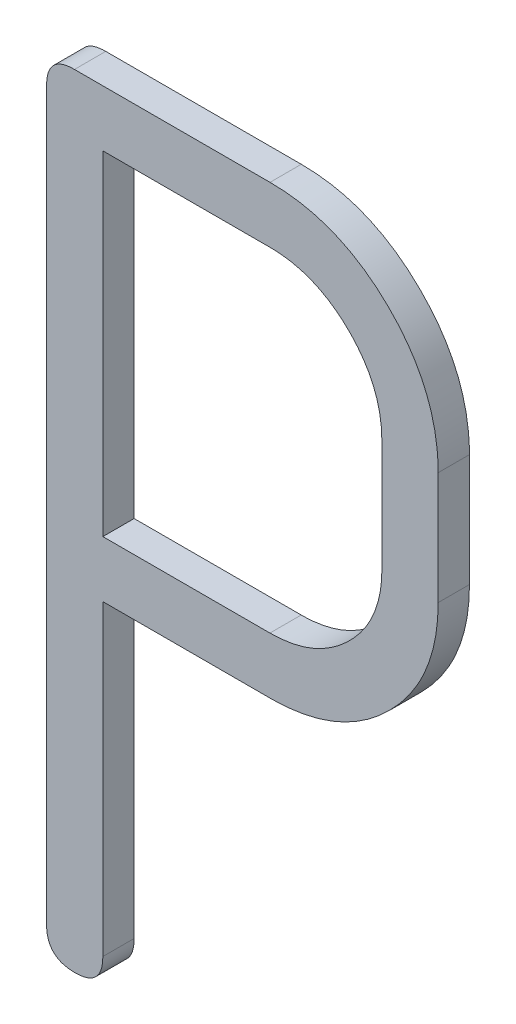
ISO-10303-21;
HEADER;
FILE_DESCRIPTION(('STEP AP214'),'2;1');
FILE_NAME('part.step','',(''),(''),'','','');
FILE_SCHEMA(('AUTOMOTIVE_DESIGN { 1 0 10303 214 1 1 1 1 }'));
ENDSEC;
DATA;
#1=APPLICATION_CONTEXT('core data for automotive mechanical design processes');
#2=APPLICATION_PROTOCOL_DEFINITION('international standard','automotive_design',2000,#1);
#3=PRODUCT_CONTEXT('',#1,'mechanical');
#4=PRODUCT('Part','Part','',(#3));
#5=PRODUCT_RELATED_PRODUCT_CATEGORY('part','',(#4));
#6=PRODUCT_DEFINITION_FORMATION('','',#4);
#7=PRODUCT_DEFINITION_CONTEXT('part definition',#1,'design');
#8=PRODUCT_DEFINITION('design','',#6,#7);
#9=PRODUCT_DEFINITION_SHAPE('','',#8);
#10=(LENGTH_UNIT() NAMED_UNIT(*) SI_UNIT(.MILLI.,.METRE.));
#11=(NAMED_UNIT(*) PLANE_ANGLE_UNIT() SI_UNIT($,.RADIAN.));
#12=(NAMED_UNIT(*) SI_UNIT($,.STERADIAN.) SOLID_ANGLE_UNIT());
#13=UNCERTAINTY_MEASURE_WITH_UNIT(LENGTH_MEASURE(1.E-05),#10,'distance_accuracy_value','');
#14=(GEOMETRIC_REPRESENTATION_CONTEXT(3) GLOBAL_UNCERTAINTY_ASSIGNED_CONTEXT((#13)) GLOBAL_UNIT_ASSIGNED_CONTEXT((#10,
#11,#12)) REPRESENTATION_CONTEXT('',''));
#15=CARTESIAN_POINT('',(0.,0.,0.));
#16=DIRECTION('',(0.,0.,1.));
#17=DIRECTION('',(1.,0.,0.));
#18=AXIS2_PLACEMENT_3D('',#15,#16,#17);
#19=CARTESIAN_POINT('',(0.,0.,1.6));
#20=DIRECTION('',(0.,0.,-1.));
#21=DIRECTION('',(-1.,0.,0.));
#22=AXIS2_PLACEMENT_3D('',#19,#20,#21);
#23=PLANE('',#22);
#24=DIRECTION('',(0.,1.,0.));
#25=VECTOR('',#24,1.);
#26=CARTESIAN_POINT('',(-3.6989437525272,0.,1.6));
#27=LINE('',#26,#25);
#28=CARTESIAN_POINT('',(-3.6989437525272,-20.1083672798276,1.6));
#29=VERTEX_POINT('',#28);
#30=CARTESIAN_POINT('',(-3.6989437525272,-20.4680547798276,1.6));
#31=VERTEX_POINT('',#30);
#32=EDGE_CURVE('E248',#29,#31,#27,.F.);
#33=ORIENTED_EDGE('',*,*,#32,.T.);
#34=CARTESIAN_POINT('',(-3.6989437525272,-20.4680547798276,1.6));
#35=CARTESIAN_POINT('',(-3.69893977911239,-20.4842043604399,1.6));
#36=CARTESIAN_POINT('',(-3.69956740178276,-20.5003633830072,1.6));
#37=CARTESIAN_POINT('',(-3.70218491900404,-20.5325881625536,1.6));
#38=CARTESIAN_POINT('',(-3.70417640120065,-20.5486537888071,1.6));
#39=CARTESIAN_POINT('',(-3.70959937157517,-20.5804136083056,1.6));
#40=CARTESIAN_POINT('',(-3.71301919440083,-20.5961097461993,1.6));
#41=CARTESIAN_POINT('',(-3.72133266115948,-20.6270933338311,1.6));
#42=CARTESIAN_POINT('',(-3.72622564042608,-20.6423809645019,1.6));
#43=CARTESIAN_POINT('',(-3.74322254794326,-20.6876324033744,1.6));
#44=CARTESIAN_POINT('',(-3.75761176773419,-20.716785285045,1.6));
#45=CARTESIAN_POINT('',(-3.78313633375931,-20.7580159064221,1.6));
#46=CARTESIAN_POINT('',(-3.79231919740512,-20.7713623608529,1.6));
#47=CARTESIAN_POINT('',(-3.81185281725684,-20.7971811642223,1.6));
#48=CARTESIAN_POINT('',(-3.82220375053391,-20.8096533801668,1.6));
#49=CARTESIAN_POINT('',(-3.84275088545525,-20.8324182182707,1.6));
#50=CARTESIAN_POINT('',(-3.85284725315506,-20.8428017549347,1.6));
#51=CARTESIAN_POINT('',(-3.87373960159541,-20.8628320989359,1.6));
#52=CARTESIAN_POINT('',(-3.88453546345096,-20.8724790308613,1.6));
#53=CARTESIAN_POINT('',(-3.91795904762217,-20.9001014927919,1.6));
#54=CARTESIAN_POINT('',(-3.94166807389486,-20.9168096438358,1.6));
#55=CARTESIAN_POINT('',(-3.99414499916089,-20.9474368329106,1.6));
#56=CARTESIAN_POINT('',(-4.0231822005852,-20.9608984793153,1.6));
#57=CARTESIAN_POINT('',(-4.08331658328884,-20.9820235646375,1.6));
#58=CARTESIAN_POINT('',(-4.11441507617614,-20.9896832724838,1.6));
#59=CARTESIAN_POINT('',(-4.1607917691538,-20.996872999856,1.6));
#60=CARTESIAN_POINT('',(-4.175776797228,-20.9985600194299,1.6));
#61=CARTESIAN_POINT('',(-4.2057803379642,-21.0007735700299,1.6));
#62=CARTESIAN_POINT('',(-4.22079854566026,-21.0013041768755,1.6));
#63=CARTESIAN_POINT('',(-4.2358187525272,-21.0013047798276,1.6));
#64=B_SPLINE_CURVE_WITH_KNOTS('',3,(#34,#35,#36,#37,#38,#39,#40,#41,#42,#43,#44,#45,#46,#47,#48,
#49,#50,#51,#52,#53,#54,#55,#56,#57,#58,#59,#60,#61,#62,#63),.UNSPECIFIED.,.F.,.F.,(4,2,2,2,2,2,
2,2,2,2,2,2,2,2,4),(0.,0.0484501258117373,0.0969567476731444,0.145074728323627,
0.193171031305145,0.289959954975703,0.338510203090539,0.387067820994286,0.430479940732755,
0.473884701468916,0.560491692403382,0.655919601948308,0.751408826644595,0.796611784497144,
0.841655163438556),.UNSPECIFIED.);
#65=CARTESIAN_POINT('',(-4.2358187525272,-21.0013047798276,1.6));
#66=VERTEX_POINT('',#65);
#67=EDGE_CURVE('E243',#31,#66,#64,.T.);
#68=ORIENTED_EDGE('',*,*,#67,.T.);
#69=DIRECTION('',(-1.,0.,0.));
#70=VECTOR('',#69,1.);
#71=CARTESIAN_POINT('',(0.,-21.0013047798276,1.6));
#72=LINE('',#71,#70);
#73=CARTESIAN_POINT('',(-4.7709437525272,-21.0013047798276,1.6));
#74=VERTEX_POINT('',#73);
#75=EDGE_CURVE('E128',#66,#74,#72,.T.);
#76=ORIENTED_EDGE('',*,*,#75,.T.);
#77=DIRECTION('',(0.,1.,0.));
#78=VECTOR('',#77,1.);
#79=CARTESIAN_POINT('',(-4.7709437525272,-21.0013047798276,1.6));
#80=LINE('',#79,#78);
#81=CARTESIAN_POINT('',(-4.7709437525272,-21.9839922798276,1.6));
#82=VERTEX_POINT('',#81);
#83=EDGE_CURVE('E159',#82,#74,#80,.T.);
#84=ORIENTED_EDGE('',*,*,#83,.F.);
#85=CARTESIAN_POINT('',(-4.7709437525272,-21.9839922798276,1.6));
#86=CARTESIAN_POINT('',(-4.7709437525272,-22.0733047798276,1.6));
#87=CARTESIAN_POINT('',(-4.8609437525272,-22.0733047798276,1.6));
#88=B_SPLINE_CURVE_WITH_KNOTS('',2,(#85,#86,#87),.UNSPECIFIED.,.F.,.F.,(3,3),(0.,1.),.UNSPECIFIED.);
#89=CARTESIAN_POINT('',(-4.8609437525272,-22.0733047798276,1.6));
#90=VERTEX_POINT('',#89);
#91=EDGE_CURVE('E227',#82,#90,#88,.T.);
#92=ORIENTED_EDGE('',*,*,#91,.T.);
#93=CARTESIAN_POINT('',(-4.8609437525272,-22.0733047798276,1.6));
#94=CARTESIAN_POINT('',(-4.9509437525272,-22.0733047798276,1.6));
#95=CARTESIAN_POINT('',(-4.9509437525272,-21.9838672798276,1.6));
#96=B_SPLINE_CURVE_WITH_KNOTS('',2,(#93,#94,#95),.UNSPECIFIED.,.F.,.F.,(3,3),(0.,1.),.UNSPECIFIED.);
#97=CARTESIAN_POINT('',(-4.9509437525272,-21.9838672798276,1.6));
#98=VERTEX_POINT('',#97);
#99=EDGE_CURVE('E232',#90,#98,#96,.T.);
#100=ORIENTED_EDGE('',*,*,#99,.T.);
#101=DIRECTION('',(0.,1.,0.));
#102=VECTOR('',#101,1.);
#103=CARTESIAN_POINT('',(-4.9509437525272,-21.9838672798276,1.6));
#104=LINE('',#103,#102);
#105=CARTESIAN_POINT('',(-4.9509437525272,-19.6627422798276,1.6));
#106=VERTEX_POINT('',#105);
#107=EDGE_CURVE('E386',#106,#98,#104,.F.);
#108=ORIENTED_EDGE('',*,*,#107,.F.);
#109=CARTESIAN_POINT('',(-4.9509437525272,-19.6627422798276,1.6));
#110=CARTESIAN_POINT('',(-4.9509437525272,-19.5733047798276,1.6));
#111=CARTESIAN_POINT('',(-4.8616312525272,-19.5733047798276,1.6));
#112=B_SPLINE_CURVE_WITH_KNOTS('',2,(#109,#110,#111),.UNSPECIFIED.,.F.,.F.,(3,3),(0.,1.),.UNSPECIFIED.);
#113=CARTESIAN_POINT('',(-4.8616312525272,-19.5733047798276,1.6));
#114=VERTEX_POINT('',#113);
#115=EDGE_CURVE('E124',#106,#114,#112,.T.);
#116=ORIENTED_EDGE('',*,*,#115,.T.);
#117=DIRECTION('',(-1.,0.,0.));
#118=VECTOR('',#117,1.);
#119=CARTESIAN_POINT('',(0.,-19.5733047798276,1.6));
#120=LINE('',#119,#118);
#121=CARTESIAN_POINT('',(-4.2365062525272,-19.5733047798276,1.6));
#122=VERTEX_POINT('',#121);
#123=EDGE_CURVE('E254',#114,#122,#120,.F.);
#124=ORIENTED_EDGE('',*,*,#123,.T.);
#125=CARTESIAN_POINT('',(-4.2365062525272,-19.5733047798276,1.6));
#126=CARTESIAN_POINT('',(-4.22030749403513,-19.5733004995456,1.6));
#127=CARTESIAN_POINT('',(-4.20409974747182,-19.5739331810774,1.6));
#128=CARTESIAN_POINT('',(-4.17178002095022,-19.5765657218345,1.6));
#129=CARTESIAN_POINT('',(-4.15566815908528,-19.5785670124189,1.6));
#130=CARTESIAN_POINT('',(-4.1238236848035,-19.5840073137464,1.6));
#131=CARTESIAN_POINT('',(-4.10808901720153,-19.587434019707,1.6));
#132=CARTESIAN_POINT('',(-4.07702471857944,-19.5957529250261,1.6));
#133=CARTESIAN_POINT('',(-4.06169492276077,-19.6006445177938,1.6));
#134=CARTESIAN_POINT('',(-4.01632670108878,-19.6176064511381,1.6));
#135=CARTESIAN_POINT('',(-3.9870872744213,-19.6319346198206,1.6));
#136=CARTESIAN_POINT('',(-3.94565790517282,-19.6573118624664,1.6));
#137=CARTESIAN_POINT('',(-3.93223157066039,-19.6664379735748,1.6));
#138=CARTESIAN_POINT('',(-3.90623000421619,-19.6858434402944,1.6));
#139=CARTESIAN_POINT('',(-3.89365492340969,-19.6961229998238,1.6));
#140=CARTESIAN_POINT('',(-3.8704644863254,-19.7167035601166,1.6));
#141=CARTESIAN_POINT('',(-3.85977435931062,-19.7269209801873,1.6));
#142=CARTESIAN_POINT('',(-3.839148705072,-19.7480842826033,1.6));
#143=CARTESIAN_POINT('',(-3.82921304581456,-19.7590300368566,1.6));
#144=CARTESIAN_POINT('',(-3.80077470352813,-19.7929517582412,1.6));
#145=CARTESIAN_POINT('',(-3.78358185840524,-19.8170634138259,1.6));
#146=CARTESIAN_POINT('',(-3.75241454746255,-19.8700954564841,1.6));
#147=CARTESIAN_POINT('',(-3.73883490618979,-19.8992500313269,1.6));
#148=CARTESIAN_POINT('',(-3.71761999188604,-19.9596702937609,1.6));
#149=CARTESIAN_POINT('',(-3.70998804541835,-19.990937152151,1.6));
#150=CARTESIAN_POINT('',(-3.70306755748842,-20.0367987932142,1.6));
#151=CARTESIAN_POINT('',(-3.70149883783485,-20.0510952390639,1.6));
#152=CARTESIAN_POINT('',(-3.69943927810337,-20.0797160847678,1.6));
#153=CARTESIAN_POINT('',(-3.69894466746037,-20.0940402095834,1.6));
#154=CARTESIAN_POINT('',(-3.6989437525272,-20.1083672798276,1.6));
#155=B_SPLINE_CURVE_WITH_KNOTS('',3,(#125,#126,#127,#128,#129,#130,#131,#132,#133,#134,#135,
#136,#137,#138,#139,#140,#141,#142,#143,#144,#145,#146,#147,#148,#149,#150,#151,#152,#153,#154),
.UNSPECIFIED.,.F.,.F.,(4,2,2,2,2,2,2,2,2,2,2,2,2,2,4),(0.,0.0485968068317986,0.0972445164896146,
0.145480718280289,0.193696973628828,0.290661396228357,0.339315410739956,0.387978040393372,
0.432303180828381,0.476620546298398,0.5650237036141,0.660898519651086,0.756826920348496,
0.79994195333816,0.84290538847964),.UNSPECIFIED.);
#156=EDGE_CURVE('E24',#122,#29,#155,.T.);
#157=ORIENTED_EDGE('',*,*,#156,.T.);
#158=EDGE_LOOP('',(#33,#68,#76,#84,#92,#100,#108,#116,#124,#157));
#159=FACE_BOUND('',#158,.T.);
#160=CARTESIAN_POINT('',(-4.2368187525272,-19.7533047798276,1.6));
#161=CARTESIAN_POINT('',(-4.21993643108536,-19.7532793325113,1.6));
#162=CARTESIAN_POINT('',(-4.20302699528636,-19.7543509612065,1.6));
#163=CARTESIAN_POINT('',(-4.16957097166548,-19.7588286025611,1.6));
#164=CARTESIAN_POINT('',(-4.1530235318154,-19.7622283423808,1.6));
#165=CARTESIAN_POINT('',(-4.11712025900054,-19.7725003066469,1.6));
#166=CARTESIAN_POINT('',(-4.0979281074245,-19.7799631629695,1.6));
#167=CARTESIAN_POINT('',(-4.06122381311458,-19.7982829223501,1.6));
#168=CARTESIAN_POINT('',(-4.04371407686202,-19.8091445952298,1.6));
#169=CARTESIAN_POINT('',(-4.01186096524409,-19.8327611259191,1.6));
#170=CARTESIAN_POINT('',(-3.99738379769844,-19.8453393652525,1.6));
#171=CARTESIAN_POINT('',(-3.97024665288515,-19.8723176344068,1.6));
#172=CARTESIAN_POINT('',(-3.95758577828429,-19.8867167579643,1.6));
#173=CARTESIAN_POINT('',(-3.93490152038423,-19.9170978781061,1.6));
#174=CARTESIAN_POINT('',(-3.9248358764232,-19.9330477818381,1.6));
#175=CARTESIAN_POINT('',(-3.90758304076111,-19.9664286873984,1.6));
#176=CARTESIAN_POINT('',(-3.90039321976837,-19.9838583185903,1.6));
#177=CARTESIAN_POINT('',(-3.88935179962353,-20.0189885427584,1.6));
#178=CARTESIAN_POINT('',(-3.88538195192311,-20.0366526457142,1.6));
#179=CARTESIAN_POINT('',(-3.88015326390216,-20.0724509781332,1.6));
#180=CARTESIAN_POINT('',(-3.87890457831325,-20.0905867138586,1.6));
#181=CARTESIAN_POINT('',(-3.8789437525272,-20.1086797798276,1.6));
#182=B_SPLINE_CURVE_WITH_KNOTS('',3,(#160,#161,#162,#163,#164,#165,#166,#167,#168,#169,#170,
#171,#172,#173,#174,#175,#176,#177,#178,#179,#180,#181),.UNSPECIFIED.,.F.,.F.,(4,2,2,2,2,2,2,2,
2,2,4),(0.,0.050649084234467,0.101162234263318,0.162565906671188,0.224056141010578,
0.281407872478153,0.338731171215174,0.395051783541889,0.45132078501729,0.505415665198384,
0.559712071408995),.UNSPECIFIED.);
#183=CARTESIAN_POINT('',(-4.2368187525272,-19.7533047798276,1.6));
#184=VERTEX_POINT('',#183);
#185=CARTESIAN_POINT('',(-3.8789437525272,-20.1086797798276,1.6));
#186=VERTEX_POINT('',#185);
#187=EDGE_CURVE('E238',#184,#186,#182,.T.);
#188=ORIENTED_EDGE('',*,*,#187,.F.);
#189=DIRECTION('',(1.,0.,0.));
#190=VECTOR('',#189,1.);
#191=CARTESIAN_POINT('',(-4.2368187525272,-19.7533047798276,1.6));
#192=LINE('',#191,#190);
#193=CARTESIAN_POINT('',(-4.7709437525272,-19.7533047798276,1.6));
#194=VERTEX_POINT('',#193);
#195=EDGE_CURVE('E260',#184,#194,#192,.F.);
#196=ORIENTED_EDGE('',*,*,#195,.T.);
#197=DIRECTION('',(0.,1.,0.));
#198=VECTOR('',#197,1.);
#199=CARTESIAN_POINT('',(-4.7709437525272,-19.7533047798276,1.6));
#200=LINE('',#199,#198);
#201=CARTESIAN_POINT('',(-4.7709437525272,-20.8213047798276,1.6));
#202=VERTEX_POINT('',#201);
#203=EDGE_CURVE('E266',#194,#202,#200,.F.);
#204=ORIENTED_EDGE('',*,*,#203,.T.);
#205=DIRECTION('',(1.,0.,0.));
#206=VECTOR('',#205,1.);
#207=CARTESIAN_POINT('',(-4.7709437525272,-20.8213047798276,1.6));
#208=LINE('',#207,#206);
#209=CARTESIAN_POINT('',(-4.2368187525272,-20.8213047798276,1.6));
#210=VERTEX_POINT('',#209);
#211=EDGE_CURVE('E247',#202,#210,#208,.T.);
#212=ORIENTED_EDGE('',*,*,#211,.T.);
#213=CARTESIAN_POINT('',(-3.8789437525272,-20.4676797798276,1.6));
#214=CARTESIAN_POINT('',(-3.878917937431,-20.4845600914227,1.6));
#215=CARTESIAN_POINT('',(-3.87999810840841,-20.5014725665827,1.6));
#216=CARTESIAN_POINT('',(-3.8845347002026,-20.5349356582669,1.6));
#217=CARTESIAN_POINT('',(-3.88798632882249,-20.5514869352268,1.6));
#218=CARTESIAN_POINT('',(-3.89834923482425,-20.5870300475625,1.6));
#219=CARTESIAN_POINT('',(-3.90580387183814,-20.605868474533,1.6));
#220=CARTESIAN_POINT('',(-3.92408364447722,-20.6418316234721,1.6));
#221=CARTESIAN_POINT('',(-3.93491103854747,-20.6589551869609,1.6));
#222=CARTESIAN_POINT('',(-3.95828832444057,-20.6897860335779,1.6));
#223=CARTESIAN_POINT('',(-3.9706255964758,-20.703658061405,1.6));
#224=CARTESIAN_POINT('',(-3.99700947626421,-20.7296762238592,1.6));
#225=CARTESIAN_POINT('',(-4.01105712503762,-20.7418212975298,1.6));
#226=CARTESIAN_POINT('',(-4.04375024928558,-20.7660702267955,1.6));
#227=CARTESIAN_POINT('',(-4.06275725420485,-20.7776994907426,1.6));
#228=CARTESIAN_POINT('',(-4.10269248727109,-20.7969504185456,1.6));
#229=CARTESIAN_POINT('',(-4.12361814196762,-20.8045773608813,1.6));
#230=CARTESIAN_POINT('',(-4.16002104841614,-20.8139274754135,1.6));
#231=CARTESIAN_POINT('',(-4.17523301047314,-20.816738375039,1.6));
#232=CARTESIAN_POINT('',(-4.20590807073811,-20.8204348147045,1.6));
#233=CARTESIAN_POINT('',(-4.22137140498774,-20.8213184255463,1.6));
#234=CARTESIAN_POINT('',(-4.2368187525272,-20.8213047798276,1.6));
#235=B_SPLINE_CURVE_WITH_KNOTS('',3,(#213,#214,#215,#216,#217,#218,#219,#220,#221,#222,#223,
#224,#225,#226,#227,#228,#229,#230,#231,#232,#233,#234),.UNSPECIFIED.,.F.,.F.,(4,2,2,2,2,2,2,2,
2,2,4),(0.,0.0506504557756446,0.101198857952106,0.161603631776791,0.22204894074358,
0.277562447449618,0.333109912943542,0.399544077322305,0.465890403095699,0.512179821202281,
0.558515553365011),.UNSPECIFIED.);
#236=CARTESIAN_POINT('',(-3.8789437525272,-20.4676797798276,1.6));
#237=VERTEX_POINT('',#236);
#238=EDGE_CURVE('E219',#237,#210,#235,.T.);
#239=ORIENTED_EDGE('',*,*,#238,.F.);
#240=DIRECTION('',(0.,1.,0.));
#241=VECTOR('',#240,1.);
#242=CARTESIAN_POINT('',(-3.8789437525272,-20.4676797798276,1.6));
#243=LINE('',#242,#241);
#244=EDGE_CURVE('E274',#237,#186,#243,.T.);
#245=ORIENTED_EDGE('',*,*,#244,.T.);
#246=EDGE_LOOP('',(#188,#196,#204,#212,#239,#245));
#247=FACE_BOUND('',#246,.T.);
#248=ADVANCED_FACE('F17',(#159,#247),#23,.T.);
#249=CARTESIAN_POINT('',(-4.7709437525272,-20.8213047798276,1.7));
#250=DIRECTION('',(0.,-1.,0.));
#251=DIRECTION('',(0.,0.,-1.));
#252=AXIS2_PLACEMENT_3D('',#249,#250,#251);
#253=PLANE('',#252);
#254=DIRECTION('',(0.,0.,1.));
#255=VECTOR('',#254,1.);
#256=CARTESIAN_POINT('',(-4.7709437525272,-20.8213047798276,1.7));
#257=LINE('',#256,#255);
#258=CARTESIAN_POINT('',(-4.7709437525272,-20.8213047798276,1.7));
#259=VERTEX_POINT('',#258);
#260=EDGE_CURVE('E262',#202,#259,#257,.T.);
#261=ORIENTED_EDGE('',*,*,#260,.T.);
#262=DIRECTION('',(-1.,0.,0.));
#263=VECTOR('',#262,1.);
#264=CARTESIAN_POINT('',(0.,-20.8213047798276,1.7));
#265=LINE('',#264,#263);
#266=CARTESIAN_POINT('',(-4.2368187525272,-20.8213047798276,1.7));
#267=VERTEX_POINT('',#266);
#268=EDGE_CURVE('E160',#259,#267,#265,.F.);
#269=ORIENTED_EDGE('',*,*,#268,.T.);
#270=DIRECTION('',(0.,0.,1.));
#271=VECTOR('',#270,1.);
#272=CARTESIAN_POINT('',(-4.2368187525272,-20.8213047798276,1.65));
#273=LINE('',#272,#271);
#274=EDGE_CURVE('E404',#210,#267,#273,.T.);
#275=ORIENTED_EDGE('',*,*,#274,.F.);
#276=ORIENTED_EDGE('',*,*,#211,.F.);
#277=EDGE_LOOP('',(#261,#269,#275,#276));
#278=FACE_BOUND('',#277,.T.);
#279=ADVANCED_FACE('F206',(#278),#253,.F.);
#280=CARTESIAN_POINT('',(-3.8789437525272,-20.4676797798276,1.7));
#281=CARTESIAN_POINT('',(-3.8789437525272,-20.6141172798276,1.7));
#282=CARTESIAN_POINT('',(-4.0908187525272,-20.8213047798276,1.7));
#283=CARTESIAN_POINT('',(-4.2368187525272,-20.8213047798276,1.7));
#284=CARTESIAN_POINT('',(-3.8789437525272,-20.4676797798276,1.6));
#285=CARTESIAN_POINT('',(-3.8789437525272,-20.6141172798276,1.6));
#286=CARTESIAN_POINT('',(-4.0908187525272,-20.8213047798276,1.6));
#287=CARTESIAN_POINT('',(-4.2368187525272,-20.8213047798276,1.6));
#288=B_SPLINE_SURFACE_WITH_KNOTS('',1,2,((#280,#281,#282,#283),(#284,#285,#286,#287)),
.UNSPECIFIED.,.F.,.F.,.F.,(2,2),(3,1,3),(0.,1.),(0.,0.5,1.),.UNSPECIFIED.);
#289=CARTESIAN_POINT('',(-4.2368187525272,-20.8213047798276,1.7));
#290=CARTESIAN_POINT('',(-4.21994034882436,-20.8213293206027,1.7));
#291=CARTESIAN_POINT('',(-4.20303525878578,-20.8202677953177,1.7));
#292=CARTESIAN_POINT('',(-4.16958120704098,-20.8158292338929,1.7));
#293=CARTESIAN_POINT('',(-4.15303143456485,-20.8124582175977,1.7));
#294=CARTESIAN_POINT('',(-4.11695194228758,-20.8022222559769,1.7));
#295=CARTESIAN_POINT('',(-4.09759129807218,-20.7947410696834,1.7));
#296=CARTESIAN_POINT('',(-4.06056418452236,-20.7763377084033,1.7));
#297=CARTESIAN_POINT('',(-4.04290029820737,-20.7654103922865,1.7));
#298=CARTESIAN_POINT('',(-4.01082382056925,-20.7416754109239,1.7));
#299=CARTESIAN_POINT('',(-3.99626974216321,-20.7290549134982,1.7));
#300=CARTESIAN_POINT('',(-3.96901651286484,-20.7019569134051,1.7));
#301=CARTESIAN_POINT('',(-3.95631600761564,-20.6874807812757,1.7));
#302=CARTESIAN_POINT('',(-3.93378949855592,-20.6571262909001,1.7));
#303=CARTESIAN_POINT('',(-3.92388484343091,-20.6413072583532,1.7));
#304=CARTESIAN_POINT('',(-3.90693034079403,-20.6082103532206,1.7));
#305=CARTESIAN_POINT('',(-3.89987846050032,-20.5909335300495,1.7));
#306=CARTESIAN_POINT('',(-3.88908178453573,-20.5561781259095,1.7));
#307=CARTESIAN_POINT('',(-3.88521196628505,-20.5387376270412,1.7));
#308=CARTESIAN_POINT('',(-3.88012045492113,-20.5034112641911,1.7));
#309=CARTESIAN_POINT('',(-3.87890725547112,-20.4855241561255,1.7));
#310=CARTESIAN_POINT('',(-3.8789437525272,-20.4676797798276,1.7));
#311=B_SPLINE_CURVE_WITH_KNOTS('',3,(#289,#290,#291,#292,#293,#294,#295,#296,#297,#298,#299,
#300,#301,#302,#303,#304,#305,#306,#307,#308,#309,#310),.UNSPECIFIED.,.F.,.F.,(4,2,2,2,2,2,2,2,
2,2,4),(0.,0.0506372580776653,0.10114302639339,0.163032139669316,0.22501402288596,
0.282620899647038,0.340185471559775,0.395917110089012,0.451608966066464,0.504991171763348,
0.558543801795676),.UNSPECIFIED.);
#312=CARTESIAN_POINT('',(-3.8789437525272,-20.4676797798276,1.7));
#313=VERTEX_POINT('',#312);
#314=EDGE_CURVE('E359',#267,#313,#311,.T.);
#315=DIRECTION('',(0.,0.,-1.));
#316=VECTOR('',#315,1.);
#317=CARTESIAN_POINT('',(-3.8789437525272,-20.4676797798276,1.7));
#318=LINE('',#317,#316);
#319=EDGE_CURVE('E277',#313,#237,#318,.T.);
#320=ORIENTED_EDGE('',*,*,#314,.T.);
#321=ORIENTED_EDGE('',*,*,#319,.T.);
#322=ORIENTED_EDGE('',*,*,#238,.T.);
#323=ORIENTED_EDGE('',*,*,#274,.T.);
#324=EDGE_LOOP('',(#320,#321,#322,#323));
#325=FACE_BOUND('',#324,.T.);
#326=ADVANCED_FACE('F204',(#325),#288,.T.);
#327=CARTESIAN_POINT('',(-3.8789437525272,-20.4676797798276,1.7));
#328=DIRECTION('',(1.,0.,0.));
#329=DIRECTION('',(0.,0.,-1.));
#330=AXIS2_PLACEMENT_3D('',#327,#328,#329);
#331=PLANE('',#330);
#332=ORIENTED_EDGE('',*,*,#319,.F.);
#333=DIRECTION('',(0.,1.,0.));
#334=VECTOR('',#333,1.);
#335=CARTESIAN_POINT('',(-3.8789437525272,0.,1.7));
#336=LINE('',#335,#334);
#337=CARTESIAN_POINT('',(-3.8789437525272,-20.1086797798276,1.7));
#338=VERTEX_POINT('',#337);
#339=EDGE_CURVE('E356',#313,#338,#336,.T.);
#340=ORIENTED_EDGE('',*,*,#339,.T.);
#341=DIRECTION('',(0.,0.,1.));
#342=VECTOR('',#341,1.);
#343=CARTESIAN_POINT('',(-3.8789437525272,-20.1086797798276,1.65));
#344=LINE('',#343,#342);
#345=EDGE_CURVE('E351',#186,#338,#344,.T.);
#346=ORIENTED_EDGE('',*,*,#345,.F.);
#347=ORIENTED_EDGE('',*,*,#244,.F.);
#348=EDGE_LOOP('',(#332,#340,#346,#347));
#349=FACE_BOUND('',#348,.T.);
#350=ADVANCED_FACE('F201',(#349),#331,.F.);
#351=CARTESIAN_POINT('',(-4.2368187525272,-19.7533047798276,1.7));
#352=CARTESIAN_POINT('',(-4.0908187525272,-19.7533047798276,1.7));
#353=CARTESIAN_POINT('',(-3.8789437525272,-19.9622422798276,1.7));
#354=CARTESIAN_POINT('',(-3.8789437525272,-20.1086797798276,1.7));
#355=CARTESIAN_POINT('',(-4.2368187525272,-19.7533047798276,1.6));
#356=CARTESIAN_POINT('',(-4.0908187525272,-19.7533047798276,1.6));
#357=CARTESIAN_POINT('',(-3.8789437525272,-19.9622422798276,1.6));
#358=CARTESIAN_POINT('',(-3.8789437525272,-20.1086797798276,1.6));
#359=B_SPLINE_SURFACE_WITH_KNOTS('',1,2,((#351,#352,#353,#354),(#355,#356,#357,#358)),
.UNSPECIFIED.,.F.,.F.,.F.,(2,2),(3,1,3),(0.,1.),(0.,0.5,1.),.UNSPECIFIED.);
#360=CARTESIAN_POINT('',(-3.8789437525272,-20.1086797798276,1.7));
#361=CARTESIAN_POINT('',(-3.87891777683518,-20.0917974897788,1.7));
#362=CARTESIAN_POINT('',(-3.87999833902172,-20.0748846401032,1.7));
#363=CARTESIAN_POINT('',(-3.88452745460666,-20.0414233400896,1.7));
#364=CARTESIAN_POINT('',(-3.88797061921768,-20.0248741487605,1.7));
#365=CARTESIAN_POINT('',(-3.89831409098213,-19.9892636578282,1.7));
#366=CARTESIAN_POINT('',(-3.90576589736131,-19.9703575801905,1.7));
#367=CARTESIAN_POINT('',(-3.92403218669586,-19.9342434517668,1.7));
#368=CARTESIAN_POINT('',(-3.9348495286097,-19.9170368610968,1.7));
#369=CARTESIAN_POINT('',(-3.95826999960197,-19.8859304501557,1.7));
#370=CARTESIAN_POINT('',(-3.97067586096584,-19.8718788901136,1.7));
#371=CARTESIAN_POINT('',(-3.99722077387968,-19.8455138675617,1.7));
#372=CARTESIAN_POINT('',(-4.01136074853968,-19.8332013383487,1.7));
#373=CARTESIAN_POINT('',(-4.04426952852117,-19.8086551397879,1.7));
#374=CARTESIAN_POINT('',(-4.06340437095684,-19.7968989357077,1.7));
#375=CARTESIAN_POINT('',(-4.10363643291054,-19.7774732779398,1.7));
#376=CARTESIAN_POINT('',(-4.12473088832639,-19.7697981675345,1.7));
#377=CARTESIAN_POINT('',(-4.16110416979707,-19.7605281766188,1.7));
#378=CARTESIAN_POINT('',(-4.17610368676723,-19.7577766307967,1.7));
#379=CARTESIAN_POINT('',(-4.20634648130597,-19.7541576305731,1.7));
#380=CARTESIAN_POINT('',(-4.22158998124729,-19.7532920066637,1.7));
#381=CARTESIAN_POINT('',(-4.2368187525272,-19.7533047798276,1.7));
#382=B_SPLINE_CURVE_WITH_KNOTS('',3,(#360,#361,#362,#363,#364,#365,#366,#367,#368,#369,#370,
#371,#372,#373,#374,#375,#376,#377,#378,#379,#380,#381),.UNSPECIFIED.,.F.,.F.,(4,2,2,2,2,2,2,2,
2,2,4),(0.,0.0506538598110524,0.101192567162747,0.161785586359492,0.222430219365135,
0.27848237173476,0.334564492587526,0.401512355124856,0.468367179145895,0.514001609669583,
0.559680313669919),.UNSPECIFIED.);
#383=CARTESIAN_POINT('',(-4.2368187525272,-19.7533047798276,1.7));
#384=VERTEX_POINT('',#383);
#385=EDGE_CURVE('E290',#338,#384,#382,.T.);
#386=DIRECTION('',(0.,0.,1.));
#387=VECTOR('',#386,1.);
#388=CARTESIAN_POINT('',(-4.2368187525272,-19.7533047798276,1.7));
#389=LINE('',#388,#387);
#390=EDGE_CURVE('E263',#384,#184,#389,.F.);
#391=ORIENTED_EDGE('',*,*,#385,.T.);
#392=ORIENTED_EDGE('',*,*,#390,.T.);
#393=ORIENTED_EDGE('',*,*,#187,.T.);
#394=ORIENTED_EDGE('',*,*,#345,.T.);
#395=EDGE_LOOP('',(#391,#392,#393,#394));
#396=FACE_BOUND('',#395,.T.);
#397=ADVANCED_FACE('F199',(#396),#359,.T.);
#398=CARTESIAN_POINT('',(-4.2368187525272,-19.7533047798276,1.7));
#399=DIRECTION('',(0.,1.,0.));
#400=DIRECTION('',(0.,0.,1.));
#401=AXIS2_PLACEMENT_3D('',#398,#399,#400);
#402=PLANE('',#401);
#403=ORIENTED_EDGE('',*,*,#390,.F.);
#404=DIRECTION('',(-1.,0.,0.));
#405=VECTOR('',#404,1.);
#406=CARTESIAN_POINT('',(0.,-19.7533047798276,1.7));
#407=LINE('',#406,#405);
#408=CARTESIAN_POINT('',(-4.7709437525272,-19.7533047798276,1.7));
#409=VERTEX_POINT('',#408);
#410=EDGE_CURVE('E355',#384,#409,#407,.T.);
#411=ORIENTED_EDGE('',*,*,#410,.T.);
#412=DIRECTION('',(0.,0.,1.));
#413=VECTOR('',#412,1.);
#414=CARTESIAN_POINT('',(-4.7709437525272,-19.7533047798276,1.7));
#415=LINE('',#414,#413);
#416=EDGE_CURVE('E269',#409,#194,#415,.F.);
#417=ORIENTED_EDGE('',*,*,#416,.T.);
#418=ORIENTED_EDGE('',*,*,#195,.F.);
#419=EDGE_LOOP('',(#403,#411,#417,#418));
#420=FACE_BOUND('',#419,.T.);
#421=ADVANCED_FACE('F195',(#420),#402,.F.);
#422=CARTESIAN_POINT('',(-4.7709437525272,-19.7533047798276,1.7));
#423=DIRECTION('',(-1.,0.,0.));
#424=DIRECTION('',(0.,0.,1.));
#425=AXIS2_PLACEMENT_3D('',#422,#423,#424);
#426=PLANE('',#425);
#427=ORIENTED_EDGE('',*,*,#416,.F.);
#428=DIRECTION('',(0.,1.,0.));
#429=VECTOR('',#428,1.);
#430=CARTESIAN_POINT('',(-4.7709437525272,0.,1.7));
#431=LINE('',#430,#429);
#432=EDGE_CURVE('E154',#409,#259,#431,.F.);
#433=ORIENTED_EDGE('',*,*,#432,.T.);
#434=ORIENTED_EDGE('',*,*,#260,.F.);
#435=ORIENTED_EDGE('',*,*,#203,.F.);
#436=EDGE_LOOP('',(#427,#433,#434,#435));
#437=FACE_BOUND('',#436,.T.);
#438=ADVANCED_FACE('F192',(#437),#426,.F.);
#439=CARTESIAN_POINT('',(-4.7709437525272,-21.0013047798276,1.7));
#440=DIRECTION('',(1.,0.,0.));
#441=DIRECTION('',(0.,0.,-1.));
#442=AXIS2_PLACEMENT_3D('',#439,#440,#441);
#443=PLANE('',#442);
#444=DIRECTION('',(0.,1.,0.));
#445=VECTOR('',#444,1.);
#446=CARTESIAN_POINT('',(-4.7709437525272,0.,1.7));
#447=LINE('',#446,#445);
#448=CARTESIAN_POINT('',(-4.7709437525272,-21.0013047798276,1.7));
#449=VERTEX_POINT('',#448);
#450=CARTESIAN_POINT('',(-4.7709437525272,-21.9839922798276,1.7));
#451=VERTEX_POINT('',#450);
#452=EDGE_CURVE('E143',#449,#451,#447,.F.);
#453=ORIENTED_EDGE('',*,*,#452,.T.);
#454=DIRECTION('',(0.,0.,-1.));
#455=VECTOR('',#454,1.);
#456=CARTESIAN_POINT('',(-4.7709437525272,-21.9839922798276,1.65));
#457=LINE('',#456,#455);
#458=EDGE_CURVE('E390',#451,#82,#457,.T.);
#459=ORIENTED_EDGE('',*,*,#458,.T.);
#460=ORIENTED_EDGE('',*,*,#83,.T.);
#461=DIRECTION('',(0.,0.,-1.));
#462=VECTOR('',#461,1.);
#463=CARTESIAN_POINT('',(-4.7709437525272,-21.0013047798276,1.7));
#464=LINE('',#463,#462);
#465=EDGE_CURVE('E157',#449,#74,#464,.T.);
#466=ORIENTED_EDGE('',*,*,#465,.F.);
#467=EDGE_LOOP('',(#453,#459,#460,#466));
#468=FACE_BOUND('',#467,.T.);
#469=ADVANCED_FACE('F158',(#468),#443,.T.);
#470=CARTESIAN_POINT('',(-4.7709437525272,-21.9839922798276,1.7));
#471=CARTESIAN_POINT('',(-4.7709437525272,-22.0733047798276,1.7));
#472=CARTESIAN_POINT('',(-4.8609437525272,-22.0733047798276,1.7));
#473=CARTESIAN_POINT('',(-4.7709437525272,-21.9839922798276,1.6));
#474=CARTESIAN_POINT('',(-4.7709437525272,-22.0733047798276,1.6));
#475=CARTESIAN_POINT('',(-4.8609437525272,-22.0733047798276,1.6));
#476=B_SPLINE_SURFACE_WITH_KNOTS('',1,2,((#470,#471,#472),(#473,#474,#475)),.UNSPECIFIED.,.F.,
.F.,.F.,(2,2),(3,3),(0.,1.),(0.,1.),.UNSPECIFIED.);
#477=CARTESIAN_POINT('',(-4.7709437525272,-21.9839922798276,1.7));
#478=CARTESIAN_POINT('',(-4.7709437525272,-22.0733047798276,1.7));
#479=CARTESIAN_POINT('',(-4.8609437525272,-22.0733047798276,1.7));
#480=B_SPLINE_CURVE_WITH_KNOTS('',2,(#477,#478,#479),.UNSPECIFIED.,.F.,.F.,(3,3),(0.,1.),.UNSPECIFIED.);
#481=CARTESIAN_POINT('',(-4.8609437525272,-22.0733047798276,1.7));
#482=VERTEX_POINT('',#481);
#483=EDGE_CURVE('E151',#451,#482,#480,.T.);
#484=DIRECTION('',(0.,0.,-1.));
#485=VECTOR('',#484,1.);
#486=CARTESIAN_POINT('',(-4.8609437525272,-22.0733047798276,1.65));
#487=LINE('',#486,#485);
#488=EDGE_CURVE('E387',#482,#90,#487,.T.);
#489=ORIENTED_EDGE('',*,*,#458,.F.);
#490=ORIENTED_EDGE('',*,*,#483,.T.);
#491=ORIENTED_EDGE('',*,*,#488,.T.);
#492=ORIENTED_EDGE('',*,*,#91,.F.);
#493=EDGE_LOOP('',(#489,#490,#491,#492));
#494=FACE_BOUND('',#493,.T.);
#495=ADVANCED_FACE('F191',(#494),#476,.F.);
#496=CARTESIAN_POINT('',(-4.8609437525272,-22.0733047798276,1.7));
#497=CARTESIAN_POINT('',(-4.9509437525272,-22.0733047798276,1.7));
#498=CARTESIAN_POINT('',(-4.9509437525272,-21.9838672798276,1.7));
#499=CARTESIAN_POINT('',(-4.8609437525272,-22.0733047798276,1.6));
#500=CARTESIAN_POINT('',(-4.9509437525272,-22.0733047798276,1.6));
#501=CARTESIAN_POINT('',(-4.9509437525272,-21.9838672798276,1.6));
#502=B_SPLINE_SURFACE_WITH_KNOTS('',1,2,((#496,#497,#498),(#499,#500,#501)),.UNSPECIFIED.,.F.,
.F.,.F.,(2,2),(3,3),(0.,1.),(0.,1.),.UNSPECIFIED.);
#503=CARTESIAN_POINT('',(-4.8609437525272,-22.0733047798276,1.7));
#504=CARTESIAN_POINT('',(-4.9509437525272,-22.0733047798276,1.7));
#505=CARTESIAN_POINT('',(-4.9509437525272,-21.9838672798276,1.7));
#506=B_SPLINE_CURVE_WITH_KNOTS('',2,(#503,#504,#505),.UNSPECIFIED.,.F.,.F.,(3,3),(0.,1.),.UNSPECIFIED.);
#507=CARTESIAN_POINT('',(-4.9509437525272,-21.9838672798276,1.7));
#508=VERTEX_POINT('',#507);
#509=EDGE_CURVE('E418',#482,#508,#506,.T.);
#510=DIRECTION('',(0.,0.,1.));
#511=VECTOR('',#510,1.);
#512=CARTESIAN_POINT('',(-4.9509437525272,-21.9838672798276,1.7));
#513=LINE('',#512,#511);
#514=EDGE_CURVE('E384',#98,#508,#513,.T.);
#515=ORIENTED_EDGE('',*,*,#488,.F.);
#516=ORIENTED_EDGE('',*,*,#509,.T.);
#517=ORIENTED_EDGE('',*,*,#514,.F.);
#518=ORIENTED_EDGE('',*,*,#99,.F.);
#519=EDGE_LOOP('',(#515,#516,#517,#518));
#520=FACE_BOUND('',#519,.T.);
#521=ADVANCED_FACE('F187',(#520),#502,.F.);
#522=CARTESIAN_POINT('',(-4.9509437525272,-21.9838672798276,1.7));
#523=DIRECTION('',(-1.,0.,0.));
#524=DIRECTION('',(0.,0.,1.));
#525=AXIS2_PLACEMENT_3D('',#522,#523,#524);
#526=PLANE('',#525);
#527=DIRECTION('',(0.,1.,0.));
#528=VECTOR('',#527,1.);
#529=CARTESIAN_POINT('',(-4.9509437525272,0.,1.7));
#530=LINE('',#529,#528);
#531=CARTESIAN_POINT('',(-4.9509437525272,-19.6627422798276,1.7));
#532=VERTEX_POINT('',#531);
#533=EDGE_CURVE('E421',#508,#532,#530,.T.);
#534=ORIENTED_EDGE('',*,*,#533,.T.);
#535=DIRECTION('',(0.,0.,-1.));
#536=VECTOR('',#535,1.);
#537=CARTESIAN_POINT('',(-4.9509437525272,-19.6627422798276,1.65));
#538=LINE('',#537,#536);
#539=EDGE_CURVE('E381',#532,#106,#538,.T.);
#540=ORIENTED_EDGE('',*,*,#539,.T.);
#541=ORIENTED_EDGE('',*,*,#107,.T.);
#542=ORIENTED_EDGE('',*,*,#514,.T.);
#543=EDGE_LOOP('',(#534,#540,#541,#542));
#544=FACE_BOUND('',#543,.T.);
#545=ADVANCED_FACE('F184',(#544),#526,.T.);
#546=CARTESIAN_POINT('',(-4.9509437525272,-19.6627422798276,1.7));
#547=CARTESIAN_POINT('',(-4.9509437525272,-19.5733047798276,1.7));
#548=CARTESIAN_POINT('',(-4.8616312525272,-19.5733047798276,1.7));
#549=CARTESIAN_POINT('',(-4.9509437525272,-19.6627422798276,1.6));
#550=CARTESIAN_POINT('',(-4.9509437525272,-19.5733047798276,1.6));
#551=CARTESIAN_POINT('',(-4.8616312525272,-19.5733047798276,1.6));
#552=B_SPLINE_SURFACE_WITH_KNOTS('',1,2,((#546,#547,#548),(#549,#550,#551)),.UNSPECIFIED.,.F.,
.F.,.F.,(2,2),(3,3),(0.,1.),(0.,1.),.UNSPECIFIED.);
#553=CARTESIAN_POINT('',(-4.9509437525272,-19.6627422798276,1.7));
#554=CARTESIAN_POINT('',(-4.9509437525272,-19.5733047798276,1.7));
#555=CARTESIAN_POINT('',(-4.8616312525272,-19.5733047798276,1.7));
#556=B_SPLINE_CURVE_WITH_KNOTS('',2,(#553,#554,#555),.UNSPECIFIED.,.F.,.F.,(3,3),(0.,1.),.UNSPECIFIED.);
#557=CARTESIAN_POINT('',(-4.8616312525272,-19.5733047798276,1.7));
#558=VERTEX_POINT('',#557);
#559=EDGE_CURVE('E425',#532,#558,#556,.T.);
#560=DIRECTION('',(0.,0.,1.));
#561=VECTOR('',#560,1.);
#562=CARTESIAN_POINT('',(-4.8616312525272,-19.5733047798276,1.7));
#563=LINE('',#562,#561);
#564=EDGE_CURVE('E379',#114,#558,#563,.T.);
#565=ORIENTED_EDGE('',*,*,#539,.F.);
#566=ORIENTED_EDGE('',*,*,#559,.T.);
#567=ORIENTED_EDGE('',*,*,#564,.F.);
#568=ORIENTED_EDGE('',*,*,#115,.F.);
#569=EDGE_LOOP('',(#565,#566,#567,#568));
#570=FACE_BOUND('',#569,.T.);
#571=ADVANCED_FACE('F182',(#570),#552,.F.);
#572=CARTESIAN_POINT('',(-4.8616312525272,-19.5733047798276,1.7));
#573=DIRECTION('',(0.,1.,0.));
#574=DIRECTION('',(0.,0.,1.));
#575=AXIS2_PLACEMENT_3D('',#572,#573,#574);
#576=PLANE('',#575);
#577=DIRECTION('',(-1.,0.,0.));
#578=VECTOR('',#577,1.);
#579=CARTESIAN_POINT('',(0.,-19.5733047798276,1.7));
#580=LINE('',#579,#578);
#581=CARTESIAN_POINT('',(-4.2365062525272,-19.5733047798276,1.7));
#582=VERTEX_POINT('',#581);
#583=EDGE_CURVE('E289',#558,#582,#580,.F.);
#584=ORIENTED_EDGE('',*,*,#583,.T.);
#585=DIRECTION('',(0.,0.,-1.));
#586=VECTOR('',#585,1.);
#587=CARTESIAN_POINT('',(-4.2365062525272,-19.5733047798276,1.65));
#588=LINE('',#587,#586);
#589=EDGE_CURVE('E376',#582,#122,#588,.T.);
#590=ORIENTED_EDGE('',*,*,#589,.T.);
#591=ORIENTED_EDGE('',*,*,#123,.F.);
#592=ORIENTED_EDGE('',*,*,#564,.T.);
#593=EDGE_LOOP('',(#584,#590,#591,#592));
#594=FACE_BOUND('',#593,.T.);
#595=ADVANCED_FACE('F179',(#594),#576,.T.);
#596=CARTESIAN_POINT('',(-4.2365062525272,-19.5733047798276,1.7));
#597=CARTESIAN_POINT('',(-4.0150687525272,-19.5733047798276,1.7));
#598=CARTESIAN_POINT('',(-3.6989437525272,-19.8864922798276,1.7));
#599=CARTESIAN_POINT('',(-3.6989437525272,-20.1083672798276,1.7));
#600=CARTESIAN_POINT('',(-4.2365062525272,-19.5733047798276,1.6));
#601=CARTESIAN_POINT('',(-4.0150687525272,-19.5733047798276,1.6));
#602=CARTESIAN_POINT('',(-3.6989437525272,-19.8864922798276,1.6));
#603=CARTESIAN_POINT('',(-3.6989437525272,-20.1083672798276,1.6));
#604=B_SPLINE_SURFACE_WITH_KNOTS('',1,2,((#596,#597,#598,#599),(#600,#601,#602,#603)),
.UNSPECIFIED.,.F.,.F.,.F.,(2,2),(3,1,3),(0.,1.),(0.,0.5,1.),.UNSPECIFIED.);
#605=CARTESIAN_POINT('',(-4.2365062525272,-19.5733047798276,1.7));
#606=CARTESIAN_POINT('',(-4.22030749403513,-19.5733004995456,1.7));
#607=CARTESIAN_POINT('',(-4.20409974747181,-19.5739331810773,1.7));
#608=CARTESIAN_POINT('',(-4.17178002095021,-19.5765657218345,1.7));
#609=CARTESIAN_POINT('',(-4.15566815908528,-19.5785670124189,1.7));
#610=CARTESIAN_POINT('',(-4.1238236848035,-19.5840073137464,1.7));
#611=CARTESIAN_POINT('',(-4.10808901720153,-19.587434019707,1.7));
#612=CARTESIAN_POINT('',(-4.07702471857944,-19.5957529250261,1.7));
#613=CARTESIAN_POINT('',(-4.06169492276077,-19.6006445177938,1.7));
#614=CARTESIAN_POINT('',(-4.01632670108878,-19.6176064511381,1.7));
#615=CARTESIAN_POINT('',(-3.9870872744213,-19.6319346198206,1.7));
#616=CARTESIAN_POINT('',(-3.94565790517282,-19.6573118624664,1.7));
#617=CARTESIAN_POINT('',(-3.93223157066039,-19.6664379735748,1.7));
#618=CARTESIAN_POINT('',(-3.90623000421619,-19.6858434402944,1.7));
#619=CARTESIAN_POINT('',(-3.8936549234097,-19.6961229998238,1.7));
#620=CARTESIAN_POINT('',(-3.8704644863254,-19.7167035601166,1.7));
#621=CARTESIAN_POINT('',(-3.85977435931062,-19.7269209801872,1.7));
#622=CARTESIAN_POINT('',(-3.839148705072,-19.7480842826033,1.7));
#623=CARTESIAN_POINT('',(-3.82921304581456,-19.7590300368566,1.7));
#624=CARTESIAN_POINT('',(-3.80077470352813,-19.7929517582412,1.7));
#625=CARTESIAN_POINT('',(-3.78358185840524,-19.8170634138259,1.7));
#626=CARTESIAN_POINT('',(-3.75241454746255,-19.8700954564841,1.7));
#627=CARTESIAN_POINT('',(-3.7388349061898,-19.8992500313269,1.7));
#628=CARTESIAN_POINT('',(-3.71761999188605,-19.9596702937609,1.7));
#629=CARTESIAN_POINT('',(-3.70998804541836,-19.990937152151,1.7));
#630=CARTESIAN_POINT('',(-3.70306755748842,-20.0367987932142,1.7));
#631=CARTESIAN_POINT('',(-3.70149883783485,-20.0510952390639,1.7));
#632=CARTESIAN_POINT('',(-3.69943927810337,-20.0797160847678,1.7));
#633=CARTESIAN_POINT('',(-3.69894466746037,-20.0940402095834,1.7));
#634=CARTESIAN_POINT('',(-3.6989437525272,-20.1083672798276,1.7));
#635=B_SPLINE_CURVE_WITH_KNOTS('',3,(#605,#606,#607,#608,#609,#610,#611,#612,#613,#614,#615,
#616,#617,#618,#619,#620,#621,#622,#623,#624,#625,#626,#627,#628,#629,#630,#631,#632,#633,#634),
.UNSPECIFIED.,.F.,.F.,(4,2,2,2,2,2,2,2,2,2,2,2,2,2,4),(0.,0.0485968068318,0.0972445164896161,
0.145480718280291,0.19369697362883,0.290661396228357,0.339315410739957,0.387978040393374,
0.432303180828381,0.476620546298396,0.565023703614097,0.660898519651077,0.75682692034848,
0.799941953338152,0.842905388479643),.UNSPECIFIED.);
#636=CARTESIAN_POINT('',(-3.6989437525272,-20.1083672798276,1.7));
#637=VERTEX_POINT('',#636);
#638=EDGE_CURVE('E283',#582,#637,#635,.T.);
#639=DIRECTION('',(0.,0.,-1.));
#640=VECTOR('',#639,1.);
#641=CARTESIAN_POINT('',(-3.6989437525272,-20.1083672798276,1.7));
#642=LINE('',#641,#640);
#643=EDGE_CURVE('E374',#29,#637,#642,.F.);
#644=ORIENTED_EDGE('',*,*,#589,.F.);
#645=ORIENTED_EDGE('',*,*,#638,.T.);
#646=ORIENTED_EDGE('',*,*,#643,.F.);
#647=ORIENTED_EDGE('',*,*,#156,.F.);
#648=EDGE_LOOP('',(#644,#645,#646,#647));
#649=FACE_BOUND('',#648,.T.);
#650=ADVANCED_FACE('F177',(#649),#604,.F.);
#651=CARTESIAN_POINT('',(-3.6989437525272,-20.1083672798276,1.7));
#652=DIRECTION('',(1.,0.,0.));
#653=DIRECTION('',(0.,0.,-1.));
#654=AXIS2_PLACEMENT_3D('',#651,#652,#653);
#655=PLANE('',#654);
#656=DIRECTION('',(0.,1.,0.));
#657=VECTOR('',#656,1.);
#658=CARTESIAN_POINT('',(-3.6989437525272,0.,1.7));
#659=LINE('',#658,#657);
#660=CARTESIAN_POINT('',(-3.6989437525272,-20.4680547798276,1.7));
#661=VERTEX_POINT('',#660);
#662=EDGE_CURVE('E282',#637,#661,#659,.F.);
#663=ORIENTED_EDGE('',*,*,#662,.T.);
#664=DIRECTION('',(0.,0.,-1.));
#665=VECTOR('',#664,1.);
#666=CARTESIAN_POINT('',(-3.6989437525272,-20.4680547798276,1.65));
#667=LINE('',#666,#665);
#668=EDGE_CURVE('E369',#661,#31,#667,.T.);
#669=ORIENTED_EDGE('',*,*,#668,.T.);
#670=ORIENTED_EDGE('',*,*,#32,.F.);
#671=ORIENTED_EDGE('',*,*,#643,.T.);
#672=EDGE_LOOP('',(#663,#669,#670,#671));
#673=FACE_BOUND('',#672,.T.);
#674=ADVANCED_FACE('F171',(#673),#655,.T.);
#675=CARTESIAN_POINT('',(-3.6989437525272,-20.4680547798276,1.7));
#676=CARTESIAN_POINT('',(-3.6989437525272,-20.6899297798276,1.7));
#677=CARTESIAN_POINT('',(-4.0128812525272,-21.0013047798276,1.7));
#678=CARTESIAN_POINT('',(-4.2358187525272,-21.0013047798276,1.7));
#679=CARTESIAN_POINT('',(-3.6989437525272,-20.4680547798276,1.6));
#680=CARTESIAN_POINT('',(-3.6989437525272,-20.6899297798276,1.6));
#681=CARTESIAN_POINT('',(-4.0128812525272,-21.0013047798276,1.6));
#682=CARTESIAN_POINT('',(-4.2358187525272,-21.0013047798276,1.6));
#683=B_SPLINE_SURFACE_WITH_KNOTS('',1,2,((#675,#676,#677,#678),(#679,#680,#681,#682)),
.UNSPECIFIED.,.F.,.F.,.F.,(2,2),(3,1,3),(0.,1.),(0.,0.5,1.),.UNSPECIFIED.);
#684=CARTESIAN_POINT('',(-3.6989437525272,-20.4680547798276,1.7));
#685=CARTESIAN_POINT('',(-3.69893977911239,-20.4842043604399,1.7));
#686=CARTESIAN_POINT('',(-3.69956740178275,-20.5003633830072,1.7));
#687=CARTESIAN_POINT('',(-3.70218491900404,-20.5325881625536,1.7));
#688=CARTESIAN_POINT('',(-3.70417640120065,-20.5486537888071,1.7));
#689=CARTESIAN_POINT('',(-3.70959937157517,-20.5804136083056,1.7));
#690=CARTESIAN_POINT('',(-3.71301919440083,-20.5961097461993,1.7));
#691=CARTESIAN_POINT('',(-3.72133266115948,-20.6270933338311,1.7));
#692=CARTESIAN_POINT('',(-3.72622564042608,-20.6423809645019,1.7));
#693=CARTESIAN_POINT('',(-3.74322254794326,-20.6876324033744,1.7));
#694=CARTESIAN_POINT('',(-3.75761176773419,-20.716785285045,1.7));
#695=CARTESIAN_POINT('',(-3.78313633375931,-20.7580159064221,1.7));
#696=CARTESIAN_POINT('',(-3.79231919740512,-20.7713623608529,1.7));
#697=CARTESIAN_POINT('',(-3.81185281725684,-20.7971811642223,1.7));
#698=CARTESIAN_POINT('',(-3.82220375053391,-20.8096533801668,1.7));
#699=CARTESIAN_POINT('',(-3.84275088545525,-20.8324182182707,1.7));
#700=CARTESIAN_POINT('',(-3.85284725315507,-20.8428017549347,1.7));
#701=CARTESIAN_POINT('',(-3.87373960159541,-20.8628320989359,1.7));
#702=CARTESIAN_POINT('',(-3.88453546345097,-20.8724790308613,1.7));
#703=CARTESIAN_POINT('',(-3.91795904762217,-20.9001014927919,1.7));
#704=CARTESIAN_POINT('',(-3.94166807389486,-20.9168096438358,1.7));
#705=CARTESIAN_POINT('',(-3.99414499916089,-20.9474368329106,1.7));
#706=CARTESIAN_POINT('',(-4.02318220058519,-20.9608984793153,1.7));
#707=CARTESIAN_POINT('',(-4.08331658328883,-20.9820235646375,1.7));
#708=CARTESIAN_POINT('',(-4.11441507617613,-20.9896832724838,1.7));
#709=CARTESIAN_POINT('',(-4.16079176915379,-20.996872999856,1.7));
#710=CARTESIAN_POINT('',(-4.17577679722799,-20.9985600194299,1.7));
#711=CARTESIAN_POINT('',(-4.2057803379642,-21.0007735700299,1.7));
#712=CARTESIAN_POINT('',(-4.22079854566026,-21.0013041768755,1.7));
#713=CARTESIAN_POINT('',(-4.2358187525272,-21.0013047798276,1.7));
#714=B_SPLINE_CURVE_WITH_KNOTS('',3,(#684,#685,#686,#687,#688,#689,#690,#691,#692,#693,#694,
#695,#696,#697,#698,#699,#700,#701,#702,#703,#704,#705,#706,#707,#708,#709,#710,#711,#712,#713),
.UNSPECIFIED.,.F.,.F.,(4,2,2,2,2,2,2,2,2,2,2,2,2,2,4),(0.,0.0484501258117373,0.0969567476731445,
0.145074728323626,0.193171031305145,0.289959954975702,0.338510203090539,0.387067820994286,
0.43047994073276,0.473884701468919,0.560491692403385,0.655919601948305,0.751408826644582,
0.796611784497139,0.841655163438557),.UNSPECIFIED.);
#715=CARTESIAN_POINT('',(-4.2358187525272,-21.0013047798276,1.7));
#716=VERTEX_POINT('',#715);
#717=EDGE_CURVE('E34',#661,#716,#714,.T.);
#718=DIRECTION('',(0.,0.,-1.));
#719=VECTOR('',#718,1.);
#720=CARTESIAN_POINT('',(-4.2358187525272,-21.0013047798276,1.7));
#721=LINE('',#720,#719);
#722=EDGE_CURVE('E42',#66,#716,#721,.F.);
#723=ORIENTED_EDGE('',*,*,#668,.F.);
#724=ORIENTED_EDGE('',*,*,#717,.T.);
#725=ORIENTED_EDGE('',*,*,#722,.F.);
#726=ORIENTED_EDGE('',*,*,#67,.F.);
#727=EDGE_LOOP('',(#723,#724,#725,#726));
#728=FACE_BOUND('',#727,.T.);
#729=ADVANCED_FACE('F19',(#728),#683,.F.);
#730=CARTESIAN_POINT('',(-4.2358187525272,-21.0013047798276,1.7));
#731=DIRECTION('',(0.,-1.,0.));
#732=DIRECTION('',(0.,0.,-1.));
#733=AXIS2_PLACEMENT_3D('',#730,#731,#732);
#734=PLANE('',#733);
#735=DIRECTION('',(-1.,0.,0.));
#736=VECTOR('',#735,1.);
#737=CARTESIAN_POINT('',(0.,-21.0013047798276,1.7));
#738=LINE('',#737,#736);
#739=EDGE_CURVE('E11',#716,#449,#738,.T.);
#740=ORIENTED_EDGE('',*,*,#739,.T.);
#741=ORIENTED_EDGE('',*,*,#465,.T.);
#742=ORIENTED_EDGE('',*,*,#75,.F.);
#743=ORIENTED_EDGE('',*,*,#722,.T.);
#744=EDGE_LOOP('',(#740,#741,#742,#743));
#745=FACE_BOUND('',#744,.T.);
#746=ADVANCED_FACE('F162',(#745),#734,.T.);
#747=CARTESIAN_POINT('',(0.,0.,1.7));
#748=DIRECTION('',(0.,0.,-1.));
#749=DIRECTION('',(-1.,0.,0.));
#750=AXIS2_PLACEMENT_3D('',#747,#748,#749);
#751=PLANE('',#750);
#752=ORIENTED_EDGE('',*,*,#717,.F.);
#753=ORIENTED_EDGE('',*,*,#662,.F.);
#754=ORIENTED_EDGE('',*,*,#638,.F.);
#755=ORIENTED_EDGE('',*,*,#583,.F.);
#756=ORIENTED_EDGE('',*,*,#559,.F.);
#757=ORIENTED_EDGE('',*,*,#533,.F.);
#758=ORIENTED_EDGE('',*,*,#509,.F.);
#759=ORIENTED_EDGE('',*,*,#483,.F.);
#760=ORIENTED_EDGE('',*,*,#452,.F.);
#761=ORIENTED_EDGE('',*,*,#739,.F.);
#762=EDGE_LOOP('',(#752,#753,#754,#755,#756,#757,#758,#759,#760,#761));
#763=FACE_BOUND('',#762,.T.);
#764=ORIENTED_EDGE('',*,*,#410,.F.);
#765=ORIENTED_EDGE('',*,*,#385,.F.);
#766=ORIENTED_EDGE('',*,*,#339,.F.);
#767=ORIENTED_EDGE('',*,*,#314,.F.);
#768=ORIENTED_EDGE('',*,*,#268,.F.);
#769=ORIENTED_EDGE('',*,*,#432,.F.);
#770=EDGE_LOOP('',(#764,#765,#766,#767,#768,#769));
#771=FACE_BOUND('',#770,.T.);
#772=ADVANCED_FACE('F146',(#763,#771),#751,.F.);
#773=CLOSED_SHELL('',(#248,#279,#326,#350,#397,#421,#438,#469,#495,#521,#545,#571,#595,#650,
#674,#729,#746,#772));
#774=MANIFOLD_SOLID_BREP('B1',#773);
#775=ADVANCED_BREP_SHAPE_REPRESENTATION('',(#18,#774),#14);
#776=SHAPE_DEFINITION_REPRESENTATION(#9,#775);
ENDSEC;
END-ISO-10303-21;
